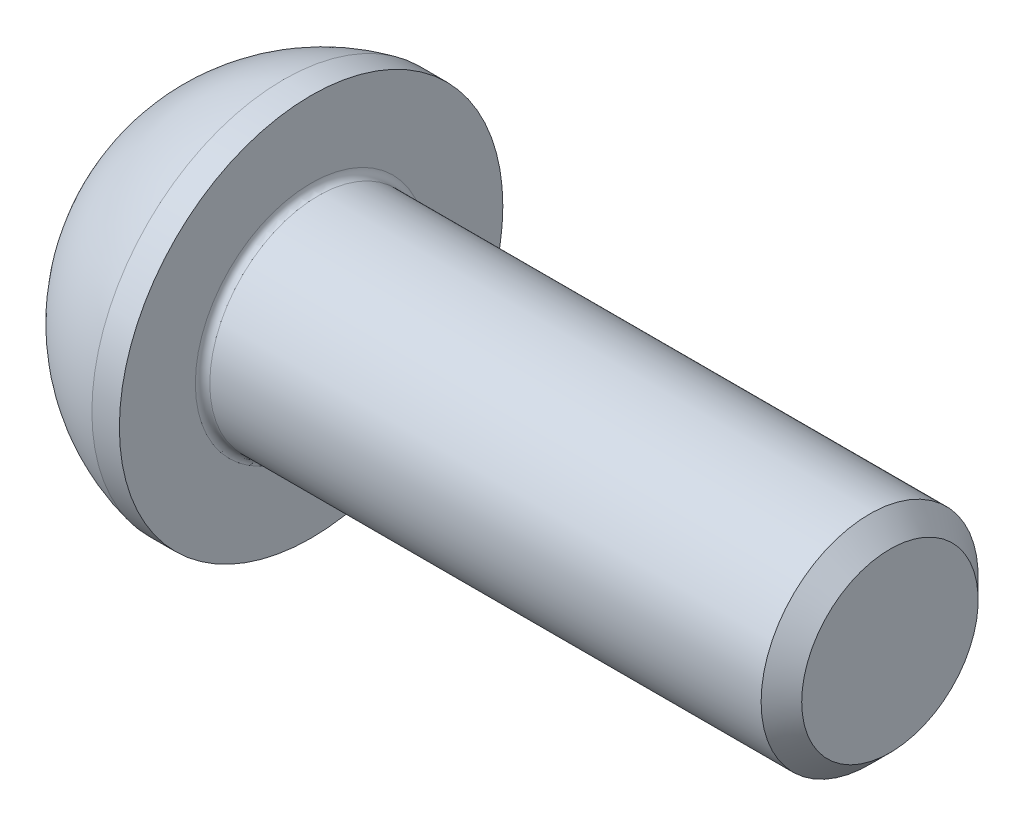
ISO-10303-21;
HEADER;
FILE_DESCRIPTION(('STEP AP214'),'2;1');
FILE_NAME('part.step','',(''),(''),'','','');
FILE_SCHEMA(('AUTOMOTIVE_DESIGN { 1 0 10303 214 1 1 1 1 }'));
ENDSEC;
DATA;
#1=APPLICATION_CONTEXT('core data for automotive mechanical design processes');
#2=APPLICATION_PROTOCOL_DEFINITION('international standard','automotive_design',2000,#1);
#3=PRODUCT_CONTEXT('',#1,'mechanical');
#4=PRODUCT('Part','Part','',(#3));
#5=PRODUCT_RELATED_PRODUCT_CATEGORY('part','',(#4));
#6=PRODUCT_DEFINITION_FORMATION('','',#4);
#7=PRODUCT_DEFINITION_CONTEXT('part definition',#1,'design');
#8=PRODUCT_DEFINITION('design','',#6,#7);
#9=PRODUCT_DEFINITION_SHAPE('','',#8);
#10=(LENGTH_UNIT() NAMED_UNIT(*) SI_UNIT(.MILLI.,.METRE.));
#11=(NAMED_UNIT(*) PLANE_ANGLE_UNIT() SI_UNIT($,.RADIAN.));
#12=(NAMED_UNIT(*) SI_UNIT($,.STERADIAN.) SOLID_ANGLE_UNIT());
#13=UNCERTAINTY_MEASURE_WITH_UNIT(LENGTH_MEASURE(1.E-05),#10,'distance_accuracy_value','');
#14=(GEOMETRIC_REPRESENTATION_CONTEXT(3) GLOBAL_UNCERTAINTY_ASSIGNED_CONTEXT((#13)) GLOBAL_UNIT_ASSIGNED_CONTEXT((#10,
#11,#12)) REPRESENTATION_CONTEXT('',''));
#15=CARTESIAN_POINT('',(0.,0.,0.));
#16=DIRECTION('',(0.,0.,1.));
#17=DIRECTION('',(1.,0.,0.));
#18=AXIS2_PLACEMENT_3D('',#15,#16,#17);
#19=CARTESIAN_POINT('',(0.,0.,0.));
#20=DIRECTION('',(-1.,0.,0.));
#21=DIRECTION('',(0.,0.,1.));
#22=AXIS2_PLACEMENT_3D('',#19,#20,#21);
#23=PLANE('',#22);
#24=CARTESIAN_POINT('',(0.,0.,0.));
#25=DIRECTION('',(-1.,0.,0.));
#26=DIRECTION('',(0.,0.,1.));
#27=AXIS2_PLACEMENT_3D('',#24,#25,#26);
#28=CIRCLE('',#27,1.325);
#29=CARTESIAN_POINT('',(0.,1.325,0.));
#30=VERTEX_POINT('',#29);
#31=EDGE_CURVE('E156',#30,#30,#28,.T.);
#32=ORIENTED_EDGE('',*,*,#31,.T.);
#33=EDGE_LOOP('',(#32));
#34=FACE_BOUND('',#33,.T.);
#35=DIRECTION('',(0.,-1.,0.));
#36=VECTOR('',#35,1.);
#37=CARTESIAN_POINT('',(0.,-0.577350269189625,0.999999999999998));
#38=LINE('',#37,#36);
#39=CARTESIAN_POINT('',(0.,0.577350269189628,1.));
#40=VERTEX_POINT('',#39);
#41=CARTESIAN_POINT('',(0.,-0.577350269189625,0.999999999999998));
#42=VERTEX_POINT('',#41);
#43=EDGE_CURVE('E51',#40,#42,#38,.T.);
#44=ORIENTED_EDGE('',*,*,#43,.T.);
#45=DIRECTION('',(0.,-0.499999999999999,-0.866025403784439));
#46=VECTOR('',#45,1.);
#47=CARTESIAN_POINT('',(0.,-1.15470053837925,0.));
#48=LINE('',#47,#46);
#49=CARTESIAN_POINT('',(0.,-1.15470053837925,0.));
#50=VERTEX_POINT('',#49);
#51=EDGE_CURVE('E276',#42,#50,#48,.T.);
#52=ORIENTED_EDGE('',*,*,#51,.T.);
#53=DIRECTION('',(0.,0.499999999999997,-0.86602540378444));
#54=VECTOR('',#53,1.);
#55=CARTESIAN_POINT('',(0.,-0.577350269189626,-1.));
#56=LINE('',#55,#54);
#57=CARTESIAN_POINT('',(0.,-0.577350269189626,-1.));
#58=VERTEX_POINT('',#57);
#59=EDGE_CURVE('E131',#50,#58,#56,.T.);
#60=ORIENTED_EDGE('',*,*,#59,.T.);
#61=DIRECTION('',(0.,1.,0.));
#62=VECTOR('',#61,1.);
#63=CARTESIAN_POINT('',(0.,0.577350269189628,-1.));
#64=LINE('',#63,#62);
#65=CARTESIAN_POINT('',(0.,0.577350269189628,-1.));
#66=VERTEX_POINT('',#65);
#67=EDGE_CURVE('E279',#58,#66,#64,.T.);
#68=ORIENTED_EDGE('',*,*,#67,.T.);
#69=DIRECTION('',(0.,0.499999999999998,0.866025403784439));
#70=VECTOR('',#69,1.);
#71=CARTESIAN_POINT('',(0.,1.15470053837925,0.));
#72=LINE('',#71,#70);
#73=CARTESIAN_POINT('',(0.,1.15470053837925,0.));
#74=VERTEX_POINT('',#73);
#75=EDGE_CURVE('E281',#66,#74,#72,.T.);
#76=ORIENTED_EDGE('',*,*,#75,.T.);
#77=DIRECTION('',(0.,-0.499999999999998,0.866025403784439));
#78=VECTOR('',#77,1.);
#79=CARTESIAN_POINT('',(0.,0.577350269189628,1.));
#80=LINE('',#79,#78);
#81=EDGE_CURVE('E283',#74,#40,#80,.T.);
#82=ORIENTED_EDGE('',*,*,#81,.T.);
#83=EDGE_LOOP('',(#44,#52,#60,#68,#76,#82));
#84=FACE_BOUND('',#83,.T.);
#85=ADVANCED_FACE('F36',(#34,#84),#23,.T.);
#86=CARTESIAN_POINT('',(2.35694368131868,0.,0.));
#87=DIRECTION('',(-1.,0.,0.));
#88=DIRECTION('',(0.,1.,0.));
#89=AXIS2_PLACEMENT_3D('',#86,#87,#88);
#90=SPHERICAL_SURFACE('',#89,2.7038506831754);
#91=CARTESIAN_POINT('',(1.82,0.,0.));
#92=DIRECTION('',(-1.,0.,0.));
#93=DIRECTION('',(0.,0.,1.));
#94=AXIS2_PLACEMENT_3D('',#91,#92,#93);
#95=CIRCLE('',#94,2.65);
#96=CARTESIAN_POINT('',(1.82,2.65,0.));
#97=VERTEX_POINT('',#96);
#98=EDGE_CURVE('E153',#97,#97,#95,.T.);
#99=CARTESIAN_POINT('',(1.82,2.65,0.));
#100=CARTESIAN_POINT('',(1.79629504668915,2.64519698187156,0.));
#101=CARTESIAN_POINT('',(1.77265457738191,2.6400757328588,0.));
#102=CARTESIAN_POINT('',(1.72551954777812,2.62920082012782,0.));
#103=CARTESIAN_POINT('',(1.70202498748159,2.62344715640959,0.));
#104=CARTESIAN_POINT('',(1.65519871690274,2.61131146133084,0.));
#105=CARTESIAN_POINT('',(1.63186700662044,2.60492942997031,0.));
#106=CARTESIAN_POINT('',(1.58538323164894,2.59154162119467,0.));
#107=CARTESIAN_POINT('',(1.56223116695974,2.58453584377955,0.));
#108=CARTESIAN_POINT('',(1.51612335693157,2.56990558095461,0.));
#109=CARTESIAN_POINT('',(1.49316761159258,2.56228109554478,0.));
#110=CARTESIAN_POINT('',(1.44746897062791,2.54641890909272,0.));
#111=CARTESIAN_POINT('',(1.42472607500224,2.5381812080505,0.));
#112=CARTESIAN_POINT('',(1.37946951109252,2.52109852193457,0.));
#113=CARTESIAN_POINT('',(1.35695584280848,2.51225353686086,0.));
#114=CARTESIAN_POINT('',(1.31217394599505,2.4939626522266,0.));
#115=CARTESIAN_POINT('',(1.28990571746566,2.48451675266605,0.));
#116=CARTESIAN_POINT('',(1.24563073586845,2.46503084116209,0.));
#117=CARTESIAN_POINT('',(1.22362398280063,2.45499082921868,0.));
#118=CARTESIAN_POINT('',(1.17988779953048,2.43432392292775,0.));
#119=CARTESIAN_POINT('',(1.15815836932815,2.42369702858023,0.));
#120=CARTESIAN_POINT('',(1.11499247949118,2.40186401007088,0.));
#121=CARTESIAN_POINT('',(1.09355601985655,2.39065788590906,0.));
#122=CARTESIAN_POINT('',(1.05099150788375,2.36767447747659,0.));
#123=CARTESIAN_POINT('',(1.02986345554558,2.35589719320595,0.));
#124=CARTESIAN_POINT('',(0.987930972805802,2.33177994556176,0.));
#125=CARTESIAN_POINT('',(0.967126542404185,2.31943998218821,0.));
#126=CARTESIAN_POINT('',(0.925856285132312,2.29420626253836,0.));
#127=CARTESIAN_POINT('',(0.905390458262056,2.28131250626205,0.));
#128=CARTESIAN_POINT('',(0.864812145814052,2.25498048580167,0.));
#129=CARTESIAN_POINT('',(0.844699660236304,2.24154222161759,0.));
#130=CARTESIAN_POINT('',(0.804842513687882,2.21413086244531,0.));
#131=CARTESIAN_POINT('',(0.785097852717208,2.20015776745711,0.));
#132=CARTESIAN_POINT('',(0.745990573821265,2.17168680892023,0.));
#133=CARTESIAN_POINT('',(0.726627955895996,2.15718894537155,0.));
#134=CARTESIAN_POINT('',(0.688298706414036,2.12767888985138,0.));
#135=CARTESIAN_POINT('',(0.669332074857345,2.11266669787989,0.));
#136=CARTESIAN_POINT('',(0.631808456279759,2.08213879602769,0.));
#137=CARTESIAN_POINT('',(0.613251469258864,2.06662308614697,0.));
#138=CARTESIAN_POINT('',(0.576560502928651,2.03509932158103,0.));
#139=CARTESIAN_POINT('',(0.558426523619335,2.01909126689579,0.));
#140=CARTESIAN_POINT('',(0.522594631273666,1.98659434037063,0.));
#141=CARTESIAN_POINT('',(0.504896718237315,1.9701054685307,0.));
#142=CARTESIAN_POINT('',(0.469949702980634,1.93665878159006,0.));
#143=CARTESIAN_POINT('',(0.452700600760305,1.91970096648934,0.));
#144=CARTESIAN_POINT('',(0.418663628483823,1.88532860461389,0.));
#145=CARTESIAN_POINT('',(0.40187575842767,1.86791405783917,0.));
#146=CARTESIAN_POINT('',(0.368773339684362,1.83264077310382,0.));
#147=CARTESIAN_POINT('',(0.352458790997208,1.81478203514319,0.));
#148=CARTESIAN_POINT('',(0.320314763361277,1.77863322838676,0.));
#149=CARTESIAN_POINT('',(0.3044852844125,1.76034315959095,0.));
#150=CARTESIAN_POINT('',(0.273322795276644,1.72334486214675,0.));
#151=CARTESIAN_POINT('',(0.257989785089564,1.70463663349835,0.));
#152=CARTESIAN_POINT('',(0.227831275133972,1.66681548836619,0.));
#153=CARTESIAN_POINT('',(0.21300577536546,1.64770257188242,0.));
#154=CARTESIAN_POINT('',(0.183872961883675,1.60908581485011,0.));
#155=CARTESIAN_POINT('',(0.169565648170402,1.58958197430156,0.));
#156=CARTESIAN_POINT('',(0.141479511349582,1.55019741318424,0.));
#157=CARTESIAN_POINT('',(0.127700688242034,1.53031669261547,0.));
#158=CARTESIAN_POINT('',(0.100681448892152,1.49019269151428,0.));
#159=CARTESIAN_POINT('',(0.0874410326498172,1.46994941098187,0.));
#160=CARTESIAN_POINT('',(0.061508164373673,1.42911485387224,0.));
#161=CARTESIAN_POINT('',(0.0488157123398635,1.40852357729502,0.));
#162=CARTESIAN_POINT('',(0.023987827747154,1.36700790688845,0.));
#163=CARTESIAN_POINT('',(0.011852395188254,1.34608351305909,0.));
#164=CARTESIAN_POINT('',(0.,1.325,0.));
#165=B_SPLINE_CURVE_WITH_KNOTS('',3,(#99,#100,#101,#102,#103,#104,#105,#106,#107,#108,#109,#110,
#111,#112,#113,#114,#115,#116,#117,#118,#119,#120,#121,#122,#123,#124,#125,#126,#127,#128,#129,
#130,#131,#132,#133,#134,#135,#136,#137,#138,#139,#140,#141,#142,#143,#144,#145,#146,#147,#148,
#149,#150,#151,#152,#153,#154,#155,#156,#157,#158,#159,#160,#161,#162,#163,#164),.UNSPECIFIED.,
.F.,.F.,(4,2,2,2,2,2,2,2,2,2,2,2,2,2,2,2,2,2,2,2,2,2,2,2,2,2,2,2,2,2,2,2,4),(0.,
0.0725577510857835,0.145115502171568,0.217673253257351,0.290231004343135,0.362788755428919,
0.435346506514703,0.507904257600486,0.58046200868627,0.653019759772054,0.725577510857838,
0.798135261943622,0.870693013029405,0.943250764115189,1.01580851520097,1.08836626628676,
1.16092401737254,1.23348176845832,1.30603951954411,1.37859727062989,1.45115502171568,
1.52371277280146,1.59627052388724,1.66882827497303,1.74138602605881,1.81394377714459,
1.88650152823038,1.95905927931616,2.03161703040195,2.10417478148773,2.17673253257351,
2.2492902836593,2.32184803474508),.UNSPECIFIED.);
#166=EDGE_CURVE('BSEAM177',#97,#30,#165,.T.);
#167=ORIENTED_EDGE('',*,*,#98,.T.);
#168=ORIENTED_EDGE('',*,*,#31,.F.);
#169=ORIENTED_EDGE('',*,*,#166,.T.);
#170=ORIENTED_EDGE('',*,*,#166,.F.);
#171=EDGE_LOOP('',(#167,#169,#168,#170));
#172=FACE_BOUND('',#171,.T.);
#173=ADVANCED_FACE('F177',(#172),#90,.T.);
#174=CARTESIAN_POINT('',(0.,0.,0.));
#175=DIRECTION('',(-1.,0.,0.));
#176=DIRECTION('',(0.,0.,1.));
#177=AXIS2_PLACEMENT_3D('',#174,#175,#176);
#178=CYLINDRICAL_SURFACE('',#177,2.65);
#179=ORIENTED_EDGE('',*,*,#98,.F.);
#180=EDGE_LOOP('',(#179));
#181=FACE_BOUND('',#180,.T.);
#182=CARTESIAN_POINT('',(2.2,0.,0.));
#183=DIRECTION('',(-1.,0.,0.));
#184=DIRECTION('',(0.,0.,1.));
#185=AXIS2_PLACEMENT_3D('',#182,#183,#184);
#186=CIRCLE('',#185,2.65);
#187=CARTESIAN_POINT('',(2.2,0.,2.65));
#188=VERTEX_POINT('',#187);
#189=EDGE_CURVE('E150',#188,#188,#186,.T.);
#190=ORIENTED_EDGE('',*,*,#189,.T.);
#191=EDGE_LOOP('',(#190));
#192=FACE_BOUND('',#191,.T.);
#193=ADVANCED_FACE('F182',(#181,#192),#178,.T.);
#194=CARTESIAN_POINT('',(2.2,1.5,0.));
#195=DIRECTION('',(-1.,0.,0.));
#196=DIRECTION('',(0.,0.,1.));
#197=AXIS2_PLACEMENT_3D('',#194,#195,#196);
#198=PLANE('',#197);
#199=CARTESIAN_POINT('',(2.2,0.,0.));
#200=DIRECTION('',(-1.,0.,0.));
#201=DIRECTION('',(0.,0.,1.));
#202=AXIS2_PLACEMENT_3D('',#199,#200,#201);
#203=CIRCLE('',#202,1.6);
#204=CARTESIAN_POINT('',(2.2,0.,1.6));
#205=VERTEX_POINT('',#204);
#206=EDGE_CURVE('E44',#205,#205,#203,.T.);
#207=ORIENTED_EDGE('',*,*,#206,.T.);
#208=EDGE_LOOP('',(#207));
#209=FACE_BOUND('',#208,.T.);
#210=ORIENTED_EDGE('',*,*,#189,.F.);
#211=EDGE_LOOP('',(#210));
#212=FACE_BOUND('',#211,.T.);
#213=ADVANCED_FACE('F161',(#209,#212),#198,.F.);
#214=CARTESIAN_POINT('',(0.,0.,0.));
#215=DIRECTION('',(-1.,0.,0.));
#216=DIRECTION('',(0.,0.,1.));
#217=AXIS2_PLACEMENT_3D('',#214,#215,#216);
#218=CYLINDRICAL_SURFACE('',#217,1.5);
#219=CARTESIAN_POINT('',(2.3,0.,0.));
#220=DIRECTION('',(-1.,0.,0.));
#221=DIRECTION('',(0.,0.,1.));
#222=AXIS2_PLACEMENT_3D('',#219,#220,#221);
#223=CIRCLE('',#222,1.5);
#224=CARTESIAN_POINT('',(2.3,0.,1.5));
#225=VERTEX_POINT('',#224);
#226=EDGE_CURVE('E11',#225,#225,#223,.F.);
#227=ORIENTED_EDGE('',*,*,#226,.T.);
#228=EDGE_LOOP('',(#227));
#229=FACE_BOUND('',#228,.T.);
#230=CARTESIAN_POINT('',(9.9195,0.,0.));
#231=DIRECTION('',(-1.,0.,0.));
#232=DIRECTION('',(0.,0.,1.));
#233=AXIS2_PLACEMENT_3D('',#230,#231,#232);
#234=CIRCLE('',#233,1.5);
#235=CARTESIAN_POINT('',(9.9195,0.,1.5));
#236=VERTEX_POINT('',#235);
#237=EDGE_CURVE('E147',#236,#236,#234,.T.);
#238=ORIENTED_EDGE('',*,*,#237,.T.);
#239=EDGE_LOOP('',(#238));
#240=FACE_BOUND('',#239,.T.);
#241=ADVANCED_FACE('F191',(#229,#240),#218,.T.);
#242=CARTESIAN_POINT('',(10.2,0.,0.));
#243=DIRECTION('',(-1.,0.,0.));
#244=DIRECTION('',(0.,0.,1.));
#245=AXIS2_PLACEMENT_3D('',#242,#243,#244);
#246=CONICAL_SURFACE('',#245,1.2195,0.785398163397446);
#247=ORIENTED_EDGE('',*,*,#237,.F.);
#248=EDGE_LOOP('',(#247));
#249=FACE_BOUND('',#248,.T.);
#250=CARTESIAN_POINT('',(10.2,0.,0.));
#251=DIRECTION('',(-1.,0.,0.));
#252=DIRECTION('',(0.,0.,1.));
#253=AXIS2_PLACEMENT_3D('',#250,#251,#252);
#254=CIRCLE('',#253,1.2195);
#255=CARTESIAN_POINT('',(10.2,0.,1.2195));
#256=VERTEX_POINT('',#255);
#257=EDGE_CURVE('E143',#256,#256,#254,.T.);
#258=ORIENTED_EDGE('',*,*,#257,.T.);
#259=EDGE_LOOP('',(#258));
#260=FACE_BOUND('',#259,.T.);
#261=ADVANCED_FACE('F172',(#249,#260),#246,.T.);
#262=CARTESIAN_POINT('',(10.2,0.,0.));
#263=DIRECTION('',(-1.,0.,0.));
#264=DIRECTION('',(0.,0.,1.));
#265=AXIS2_PLACEMENT_3D('',#262,#263,#264);
#266=PLANE('',#265);
#267=ORIENTED_EDGE('',*,*,#257,.F.);
#268=EDGE_LOOP('',(#267));
#269=FACE_BOUND('',#268,.T.);
#270=ADVANCED_FACE('F165',(#269),#266,.F.);
#271=CARTESIAN_POINT('',(2.3,0.,0.));
#272=DIRECTION('',(-1.,0.,0.));
#273=DIRECTION('',(0.,0.,1.));
#274=AXIS2_PLACEMENT_3D('',#271,#272,#273);
#275=TOROIDAL_SURFACE('',#274,1.6,0.1);
#276=ORIENTED_EDGE('',*,*,#226,.F.);
#277=EDGE_LOOP('',(#276));
#278=FACE_BOUND('',#277,.T.);
#279=ORIENTED_EDGE('',*,*,#206,.F.);
#280=EDGE_LOOP('',(#279));
#281=FACE_BOUND('',#280,.T.);
#282=ADVANCED_FACE('F38',(#278,#281),#275,.F.);
#283=CARTESIAN_POINT('',(1.04,-1.15470053837925,0.));
#284=DIRECTION('',(0.,0.866025403784439,-0.499999999999999));
#285=DIRECTION('',(0.,0.499999999999999,0.866025403784439));
#286=AXIS2_PLACEMENT_3D('',#283,#284,#285);
#287=PLANE('',#286);
#288=DIRECTION('',(0.,-0.499999999999999,-0.866025403784439));
#289=VECTOR('',#288,1.);
#290=CARTESIAN_POINT('',(1.04,-1.15470053837925,0.));
#291=LINE('',#290,#289);
#292=CARTESIAN_POINT('',(1.04,-0.577350269189625,0.999999999999998));
#293=VERTEX_POINT('',#292);
#294=CARTESIAN_POINT('',(1.04,-0.866025403784437,0.499999999999998));
#295=VERTEX_POINT('',#294);
#296=EDGE_CURVE('E117',#293,#295,#291,.T.);
#297=ORIENTED_EDGE('',*,*,#296,.T.);
#298=CARTESIAN_POINT('',(1.04,-1.15470053837925,0.));
#299=VERTEX_POINT('',#298);
#300=EDGE_CURVE('E112',#295,#299,#291,.T.);
#301=ORIENTED_EDGE('',*,*,#300,.T.);
#302=DIRECTION('',(-1.,0.,0.));
#303=VECTOR('',#302,1.);
#304=CARTESIAN_POINT('',(1.04,-1.15470053837925,0.));
#305=LINE('',#304,#303);
#306=EDGE_CURVE('E114',#299,#50,#305,.T.);
#307=ORIENTED_EDGE('',*,*,#306,.T.);
#308=ORIENTED_EDGE('',*,*,#51,.F.);
#309=DIRECTION('',(-1.,0.,0.));
#310=VECTOR('',#309,1.);
#311=CARTESIAN_POINT('',(1.04,-0.577350269189625,0.999999999999998));
#312=LINE('',#311,#310);
#313=EDGE_CURVE('E272',#293,#42,#312,.T.);
#314=ORIENTED_EDGE('',*,*,#313,.F.);
#315=EDGE_LOOP('',(#297,#301,#307,#308,#314));
#316=FACE_BOUND('',#315,.T.);
#317=ADVANCED_FACE('F113',(#316),#287,.T.);
#318=CARTESIAN_POINT('',(1.04,-0.577350269189626,-1.));
#319=DIRECTION('',(0.,0.86602540378444,0.499999999999998));
#320=DIRECTION('',(0.,-0.499999999999998,0.86602540378444));
#321=AXIS2_PLACEMENT_3D('',#318,#319,#320);
#322=PLANE('',#321);
#323=DIRECTION('',(0.,0.499999999999997,-0.86602540378444));
#324=VECTOR('',#323,1.);
#325=CARTESIAN_POINT('',(1.04,-0.577350269189626,-1.));
#326=LINE('',#325,#324);
#327=CARTESIAN_POINT('',(1.04,-0.86602540378444,-0.499999999999997));
#328=VERTEX_POINT('',#327);
#329=EDGE_CURVE('E59',#299,#328,#326,.T.);
#330=ORIENTED_EDGE('',*,*,#329,.T.);
#331=CARTESIAN_POINT('',(1.04,-0.577350269189626,-1.));
#332=VERTEX_POINT('',#331);
#333=EDGE_CURVE('E126',#328,#332,#326,.T.);
#334=ORIENTED_EDGE('',*,*,#333,.T.);
#335=DIRECTION('',(-1.,0.,0.));
#336=VECTOR('',#335,1.);
#337=CARTESIAN_POINT('',(1.04,-0.577350269189626,-1.));
#338=LINE('',#337,#336);
#339=EDGE_CURVE('E133',#332,#58,#338,.T.);
#340=ORIENTED_EDGE('',*,*,#339,.T.);
#341=ORIENTED_EDGE('',*,*,#59,.F.);
#342=ORIENTED_EDGE('',*,*,#306,.F.);
#343=EDGE_LOOP('',(#330,#334,#340,#341,#342));
#344=FACE_BOUND('',#343,.T.);
#345=ADVANCED_FACE('F129',(#344),#322,.T.);
#346=CARTESIAN_POINT('',(1.04,0.577350269189628,-1.));
#347=DIRECTION('',(0.,0.,1.));
#348=DIRECTION('',(0.,-1.,0.));
#349=AXIS2_PLACEMENT_3D('',#346,#347,#348);
#350=PLANE('',#349);
#351=DIRECTION('',(0.,1.,0.));
#352=VECTOR('',#351,1.);
#353=CARTESIAN_POINT('',(1.04,0.577350269189628,-1.));
#354=LINE('',#353,#352);
#355=CARTESIAN_POINT('',(1.04,0.,-1.));
#356=VERTEX_POINT('',#355);
#357=EDGE_CURVE('E253',#332,#356,#354,.T.);
#358=ORIENTED_EDGE('',*,*,#357,.T.);
#359=CARTESIAN_POINT('',(1.04,0.577350269189628,-1.));
#360=VERTEX_POINT('',#359);
#361=EDGE_CURVE('E125',#356,#360,#354,.T.);
#362=ORIENTED_EDGE('',*,*,#361,.T.);
#363=DIRECTION('',(-1.,0.,0.));
#364=VECTOR('',#363,1.);
#365=CARTESIAN_POINT('',(1.04,0.577350269189628,-1.));
#366=LINE('',#365,#364);
#367=EDGE_CURVE('E138',#360,#66,#366,.T.);
#368=ORIENTED_EDGE('',*,*,#367,.T.);
#369=ORIENTED_EDGE('',*,*,#67,.F.);
#370=ORIENTED_EDGE('',*,*,#339,.F.);
#371=EDGE_LOOP('',(#358,#362,#368,#369,#370));
#372=FACE_BOUND('',#371,.T.);
#373=ADVANCED_FACE('F205',(#372),#350,.T.);
#374=CARTESIAN_POINT('',(1.04,1.15470053837925,0.));
#375=DIRECTION('',(0.,-0.86602540378444,0.499999999999998));
#376=DIRECTION('',(0.,-0.499999999999998,-0.86602540378444));
#377=AXIS2_PLACEMENT_3D('',#374,#375,#376);
#378=PLANE('',#377);
#379=DIRECTION('',(0.,0.499999999999998,0.866025403784439));
#380=VECTOR('',#379,1.);
#381=CARTESIAN_POINT('',(1.04,1.15470053837925,0.));
#382=LINE('',#381,#380);
#383=CARTESIAN_POINT('',(1.04,0.86602540378444,-0.499999999999999));
#384=VERTEX_POINT('',#383);
#385=EDGE_CURVE('E242',#360,#384,#382,.T.);
#386=ORIENTED_EDGE('',*,*,#385,.T.);
#387=CARTESIAN_POINT('',(1.04,1.15470053837925,0.));
#388=VERTEX_POINT('',#387);
#389=EDGE_CURVE('E247',#384,#388,#382,.T.);
#390=ORIENTED_EDGE('',*,*,#389,.T.);
#391=DIRECTION('',(-1.,0.,0.));
#392=VECTOR('',#391,1.);
#393=CARTESIAN_POINT('',(1.04,1.15470053837925,0.));
#394=LINE('',#393,#392);
#395=EDGE_CURVE('E287',#388,#74,#394,.T.);
#396=ORIENTED_EDGE('',*,*,#395,.T.);
#397=ORIENTED_EDGE('',*,*,#75,.F.);
#398=ORIENTED_EDGE('',*,*,#367,.F.);
#399=EDGE_LOOP('',(#386,#390,#396,#397,#398));
#400=FACE_BOUND('',#399,.T.);
#401=ADVANCED_FACE('F208',(#400),#378,.T.);
#402=CARTESIAN_POINT('',(1.04,0.577350269189628,1.));
#403=DIRECTION('',(0.,-0.86602540378444,-0.499999999999998));
#404=DIRECTION('',(0.,0.499999999999998,-0.86602540378444));
#405=AXIS2_PLACEMENT_3D('',#402,#403,#404);
#406=PLANE('',#405);
#407=DIRECTION('',(0.,-0.499999999999998,0.866025403784439));
#408=VECTOR('',#407,1.);
#409=CARTESIAN_POINT('',(1.04,0.577350269189628,1.));
#410=LINE('',#409,#408);
#411=CARTESIAN_POINT('',(1.04,0.86602540378444,0.499999999999999));
#412=VERTEX_POINT('',#411);
#413=EDGE_CURVE('E250',#388,#412,#410,.T.);
#414=ORIENTED_EDGE('',*,*,#413,.T.);
#415=CARTESIAN_POINT('',(1.04,0.577350269189628,1.));
#416=VERTEX_POINT('',#415);
#417=EDGE_CURVE('E258',#412,#416,#410,.T.);
#418=ORIENTED_EDGE('',*,*,#417,.T.);
#419=DIRECTION('',(-1.,0.,0.));
#420=VECTOR('',#419,1.);
#421=CARTESIAN_POINT('',(1.04,0.577350269189628,1.));
#422=LINE('',#421,#420);
#423=EDGE_CURVE('E271',#416,#40,#422,.T.);
#424=ORIENTED_EDGE('',*,*,#423,.T.);
#425=ORIENTED_EDGE('',*,*,#81,.F.);
#426=ORIENTED_EDGE('',*,*,#395,.F.);
#427=EDGE_LOOP('',(#414,#418,#424,#425,#426));
#428=FACE_BOUND('',#427,.T.);
#429=ADVANCED_FACE('F212',(#428),#406,.T.);
#430=CARTESIAN_POINT('',(1.04,-0.577350269189625,0.999999999999998));
#431=DIRECTION('',(0.,0.,-1.));
#432=DIRECTION('',(0.,1.,0.));
#433=AXIS2_PLACEMENT_3D('',#430,#431,#432);
#434=PLANE('',#433);
#435=DIRECTION('',(0.,-1.,0.));
#436=VECTOR('',#435,1.);
#437=CARTESIAN_POINT('',(1.04,-0.577350269189625,0.999999999999998));
#438=LINE('',#437,#436);
#439=CARTESIAN_POINT('',(1.04,0.,1.));
#440=VERTEX_POINT('',#439);
#441=EDGE_CURVE('E264',#416,#440,#438,.T.);
#442=ORIENTED_EDGE('',*,*,#441,.T.);
#443=EDGE_CURVE('E266',#440,#293,#438,.T.);
#444=ORIENTED_EDGE('',*,*,#443,.T.);
#445=ORIENTED_EDGE('',*,*,#313,.T.);
#446=ORIENTED_EDGE('',*,*,#43,.F.);
#447=ORIENTED_EDGE('',*,*,#423,.F.);
#448=EDGE_LOOP('',(#442,#444,#445,#446,#447));
#449=FACE_BOUND('',#448,.T.);
#450=ADVANCED_FACE('F216',(#449),#434,.T.);
#451=CARTESIAN_POINT('',(1.04,-1.73205080756887,-0.999999999999999));
#452=DIRECTION('',(1.,0.,0.));
#453=DIRECTION('',(0.,0.,-1.));
#454=AXIS2_PLACEMENT_3D('',#451,#452,#453);
#455=PLANE('',#454);
#456=CARTESIAN_POINT('',(1.04,0.,0.));
#457=DIRECTION('',(-1.,0.,0.));
#458=DIRECTION('',(0.,0.,1.));
#459=AXIS2_PLACEMENT_3D('',#456,#457,#458);
#460=CIRCLE('',#459,1.);
#461=EDGE_CURVE('E239',#384,#356,#460,.T.);
#462=ORIENTED_EDGE('',*,*,#461,.F.);
#463=ORIENTED_EDGE('',*,*,#385,.F.);
#464=ORIENTED_EDGE('',*,*,#361,.F.);
#465=EDGE_LOOP('',(#462,#463,#464));
#466=FACE_BOUND('',#465,.T.);
#467=ADVANCED_FACE('F220',(#466),#455,.F.);
#468=EDGE_CURVE('E144',#412,#384,#460,.T.);
#469=ORIENTED_EDGE('',*,*,#468,.F.);
#470=ORIENTED_EDGE('',*,*,#413,.F.);
#471=ORIENTED_EDGE('',*,*,#389,.F.);
#472=EDGE_LOOP('',(#469,#470,#471));
#473=FACE_BOUND('',#472,.T.);
#474=ADVANCED_FACE('F229',(#473),#455,.F.);
#475=EDGE_CURVE('E137',#440,#412,#460,.T.);
#476=ORIENTED_EDGE('',*,*,#475,.F.);
#477=ORIENTED_EDGE('',*,*,#441,.F.);
#478=ORIENTED_EDGE('',*,*,#417,.F.);
#479=EDGE_LOOP('',(#476,#477,#478));
#480=FACE_BOUND('',#479,.T.);
#481=ADVANCED_FACE('F234',(#480),#455,.F.);
#482=EDGE_CURVE('E132',#295,#440,#460,.T.);
#483=ORIENTED_EDGE('',*,*,#482,.F.);
#484=ORIENTED_EDGE('',*,*,#296,.F.);
#485=ORIENTED_EDGE('',*,*,#443,.F.);
#486=EDGE_LOOP('',(#483,#484,#485));
#487=FACE_BOUND('',#486,.T.);
#488=ADVANCED_FACE('F227',(#487),#455,.F.);
#489=EDGE_CURVE('E123',#328,#295,#460,.T.);
#490=ORIENTED_EDGE('',*,*,#489,.F.);
#491=ORIENTED_EDGE('',*,*,#329,.F.);
#492=ORIENTED_EDGE('',*,*,#300,.F.);
#493=EDGE_LOOP('',(#490,#491,#492));
#494=FACE_BOUND('',#493,.T.);
#495=ADVANCED_FACE('F122',(#494),#455,.F.);
#496=EDGE_CURVE('E245',#356,#328,#460,.T.);
#497=ORIENTED_EDGE('',*,*,#496,.F.);
#498=ORIENTED_EDGE('',*,*,#357,.F.);
#499=ORIENTED_EDGE('',*,*,#333,.F.);
#500=EDGE_LOOP('',(#497,#498,#499));
#501=FACE_BOUND('',#500,.T.);
#502=ADVANCED_FACE('F200',(#501),#455,.F.);
#503=CARTESIAN_POINT('',(1.61735026918963,0.,0.));
#504=DIRECTION('',(-1.,0.,0.));
#505=DIRECTION('',(0.,0.,1.));
#506=AXIS2_PLACEMENT_3D('',#503,#504,#505);
#507=CONICAL_SURFACE('',#506,0.,1.04719755119659);
#508=ORIENTED_EDGE('',*,*,#475,.T.);
#509=ORIENTED_EDGE('',*,*,#468,.T.);
#510=ORIENTED_EDGE('',*,*,#461,.T.);
#511=ORIENTED_EDGE('',*,*,#496,.T.);
#512=ORIENTED_EDGE('',*,*,#489,.T.);
#513=ORIENTED_EDGE('',*,*,#482,.T.);
#514=EDGE_LOOP('',(#508,#509,#510,#511,#512,#513));
#515=FACE_BOUND('',#514,.T.);
#516=CARTESIAN_POINT('',(1.61735026918963,0.,0.));
#517=VERTEX_POINT('',#516);
#518=VERTEX_LOOP('',#517);
#519=FACE_BOUND('',#518,.T.);
#520=ADVANCED_FACE('F198',(#515,#519),#507,.F.);
#521=CLOSED_SHELL('',(#85,#173,#193,#213,#241,#261,#270,#282,#317,#345,#373,#401,#429,#450,#467,
#474,#481,#488,#495,#502,#520));
#522=MANIFOLD_SOLID_BREP('B2',#521);
#523=ADVANCED_BREP_SHAPE_REPRESENTATION('',(#18,#522),#14);
#524=SHAPE_DEFINITION_REPRESENTATION(#9,#523);
ENDSEC;
END-ISO-10303-21;
